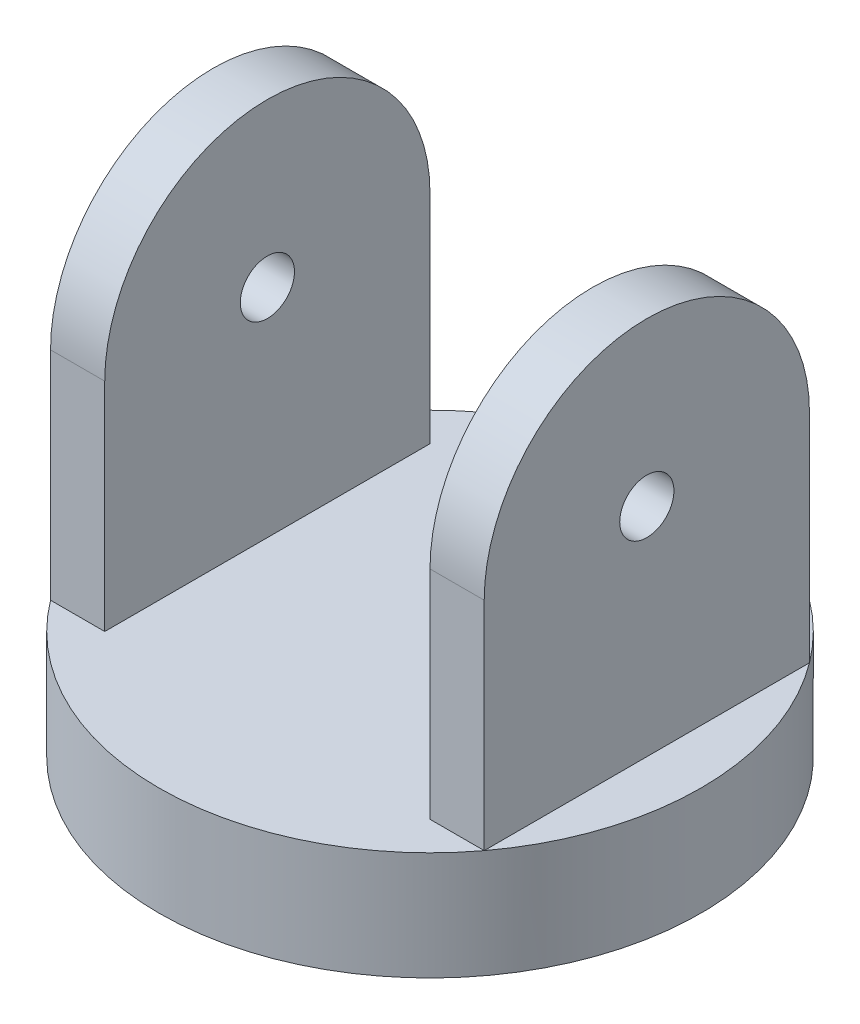
ISO-10303-21;
HEADER;
FILE_DESCRIPTION(('STEP AP214'),'2;1');
FILE_NAME('part.step','',(''),(''),'','','');
FILE_SCHEMA(('AUTOMOTIVE_DESIGN { 1 0 10303 214 1 1 1 1 }'));
ENDSEC;
DATA;
#1=APPLICATION_CONTEXT('core data for automotive mechanical design processes');
#2=APPLICATION_PROTOCOL_DEFINITION('international standard','automotive_design',2000,#1);
#3=PRODUCT_CONTEXT('',#1,'mechanical');
#4=PRODUCT('Part','Part','',(#3));
#5=PRODUCT_RELATED_PRODUCT_CATEGORY('part','',(#4));
#6=PRODUCT_DEFINITION_FORMATION('','',#4);
#7=PRODUCT_DEFINITION_CONTEXT('part definition',#1,'design');
#8=PRODUCT_DEFINITION('design','',#6,#7);
#9=PRODUCT_DEFINITION_SHAPE('','',#8);
#10=(LENGTH_UNIT() NAMED_UNIT(*) SI_UNIT(.MILLI.,.METRE.));
#11=(NAMED_UNIT(*) PLANE_ANGLE_UNIT() SI_UNIT($,.RADIAN.));
#12=(NAMED_UNIT(*) SI_UNIT($,.STERADIAN.) SOLID_ANGLE_UNIT());
#13=UNCERTAINTY_MEASURE_WITH_UNIT(LENGTH_MEASURE(1.E-05),#10,'distance_accuracy_value','');
#14=(GEOMETRIC_REPRESENTATION_CONTEXT(3) GLOBAL_UNCERTAINTY_ASSIGNED_CONTEXT((#13)) GLOBAL_UNIT_ASSIGNED_CONTEXT((#10,
#11,#12)) REPRESENTATION_CONTEXT('',''));
#15=CARTESIAN_POINT('',(0.,0.,0.));
#16=DIRECTION('',(0.,0.,1.));
#17=DIRECTION('',(1.,0.,0.));
#18=AXIS2_PLACEMENT_3D('',#15,#16,#17);
#19=CARTESIAN_POINT('',(20.,50.,15.));
#20=DIRECTION('',(-1.,0.,0.));
#21=DIRECTION('',(0.,0.,1.));
#22=AXIS2_PLACEMENT_3D('',#19,#20,#21);
#23=PLANE('',#22);
#24=CARTESIAN_POINT('',(20.,30.,0.));
#25=DIRECTION('',(-1.,0.,0.));
#26=DIRECTION('',(0.,0.,1.));
#27=AXIS2_PLACEMENT_3D('',#24,#25,#26);
#28=CIRCLE('',#27,2.5);
#29=CARTESIAN_POINT('',(20.,30.,2.50000000000001));
#30=VERTEX_POINT('',#29);
#31=EDGE_CURVE('E133',#30,#30,#28,.T.);
#32=ORIENTED_EDGE('',*,*,#31,.T.);
#33=EDGE_LOOP('',(#32));
#34=FACE_BOUND('',#33,.T.);
#35=CARTESIAN_POINT('',(20.,30.,0.));
#36=DIRECTION('',(-1.,0.,0.));
#37=DIRECTION('',(0.,0.,1.));
#38=AXIS2_PLACEMENT_3D('',#35,#36,#37);
#39=CIRCLE('',#38,15.);
#40=CARTESIAN_POINT('',(20.,30.,15.));
#41=VERTEX_POINT('',#40);
#42=CARTESIAN_POINT('',(20.,30.,-15.));
#43=VERTEX_POINT('',#42);
#44=EDGE_CURVE('E194',#41,#43,#39,.T.);
#45=ORIENTED_EDGE('',*,*,#44,.F.);
#46=DIRECTION('',(0.,-1.,0.));
#47=VECTOR('',#46,1.);
#48=CARTESIAN_POINT('',(20.,50.,15.));
#49=LINE('',#48,#47);
#50=CARTESIAN_POINT('',(20.,10.,15.));
#51=VERTEX_POINT('',#50);
#52=EDGE_CURVE('E158',#41,#51,#49,.T.);
#53=ORIENTED_EDGE('',*,*,#52,.T.);
#54=DIRECTION('',(0.,0.,-1.));
#55=VECTOR('',#54,1.);
#56=CARTESIAN_POINT('',(20.,10.,15.));
#57=LINE('',#56,#55);
#58=CARTESIAN_POINT('',(20.,10.,-15.));
#59=VERTEX_POINT('',#58);
#60=EDGE_CURVE('E141',#51,#59,#57,.T.);
#61=ORIENTED_EDGE('',*,*,#60,.T.);
#62=DIRECTION('',(0.,-1.,0.));
#63=VECTOR('',#62,1.);
#64=CARTESIAN_POINT('',(20.,50.,-15.));
#65=LINE('',#64,#63);
#66=EDGE_CURVE('E164',#43,#59,#65,.T.);
#67=ORIENTED_EDGE('',*,*,#66,.F.);
#68=EDGE_LOOP('',(#45,#53,#61,#67));
#69=FACE_BOUND('',#68,.T.);
#70=ADVANCED_FACE('F50',(#34,#69),#23,.F.);
#71=CARTESIAN_POINT('',(20.,50.,-15.));
#72=DIRECTION('',(0.,0.,1.));
#73=DIRECTION('',(1.,0.,0.));
#74=AXIS2_PLACEMENT_3D('',#71,#72,#73);
#75=PLANE('',#74);
#76=DIRECTION('',(-1.,0.,0.));
#77=VECTOR('',#76,1.);
#78=CARTESIAN_POINT('',(25.,30.,-15.));
#79=LINE('',#78,#77);
#80=CARTESIAN_POINT('',(15.,30.,-15.));
#81=VERTEX_POINT('',#80);
#82=EDGE_CURVE('E122',#43,#81,#79,.T.);
#83=ORIENTED_EDGE('',*,*,#82,.F.);
#84=ORIENTED_EDGE('',*,*,#66,.T.);
#85=DIRECTION('',(-1.,0.,0.));
#86=VECTOR('',#85,1.);
#87=CARTESIAN_POINT('',(20.,10.,-15.));
#88=LINE('',#87,#86);
#89=CARTESIAN_POINT('',(15.,10.,-15.));
#90=VERTEX_POINT('',#89);
#91=EDGE_CURVE('E149',#59,#90,#88,.T.);
#92=ORIENTED_EDGE('',*,*,#91,.T.);
#93=DIRECTION('',(0.,-1.,0.));
#94=VECTOR('',#93,1.);
#95=CARTESIAN_POINT('',(15.,50.,-15.));
#96=LINE('',#95,#94);
#97=EDGE_CURVE('E162',#81,#90,#96,.T.);
#98=ORIENTED_EDGE('',*,*,#97,.F.);
#99=EDGE_LOOP('',(#83,#84,#92,#98));
#100=FACE_BOUND('',#99,.T.);
#101=ADVANCED_FACE('F201',(#100),#75,.F.);
#102=CARTESIAN_POINT('',(15.,50.,15.));
#103=DIRECTION('',(1.,0.,0.));
#104=DIRECTION('',(0.,0.,-1.));
#105=AXIS2_PLACEMENT_3D('',#102,#103,#104);
#106=PLANE('',#105);
#107=CARTESIAN_POINT('',(15.,30.,0.));
#108=DIRECTION('',(1.,0.,0.));
#109=DIRECTION('',(0.,0.,-1.));
#110=AXIS2_PLACEMENT_3D('',#107,#108,#109);
#111=CIRCLE('',#110,2.5);
#112=CARTESIAN_POINT('',(15.,30.,-2.49999999999999));
#113=VERTEX_POINT('',#112);
#114=EDGE_CURVE('E267',#113,#113,#111,.T.);
#115=ORIENTED_EDGE('',*,*,#114,.T.);
#116=EDGE_LOOP('',(#115));
#117=FACE_BOUND('',#116,.T.);
#118=CARTESIAN_POINT('',(15.,30.,0.));
#119=DIRECTION('',(1.,0.,0.));
#120=DIRECTION('',(0.,0.,-1.));
#121=AXIS2_PLACEMENT_3D('',#118,#119,#120);
#122=CIRCLE('',#121,15.);
#123=CARTESIAN_POINT('',(15.,30.,15.));
#124=VERTEX_POINT('',#123);
#125=EDGE_CURVE('E67',#81,#124,#122,.T.);
#126=ORIENTED_EDGE('',*,*,#125,.F.);
#127=ORIENTED_EDGE('',*,*,#97,.T.);
#128=DIRECTION('',(0.,0.,1.));
#129=VECTOR('',#128,1.);
#130=CARTESIAN_POINT('',(15.,10.,15.));
#131=LINE('',#130,#129);
#132=CARTESIAN_POINT('',(15.,10.,15.));
#133=VERTEX_POINT('',#132);
#134=EDGE_CURVE('E152',#90,#133,#131,.T.);
#135=ORIENTED_EDGE('',*,*,#134,.T.);
#136=DIRECTION('',(0.,-1.,0.));
#137=VECTOR('',#136,1.);
#138=CARTESIAN_POINT('',(15.,50.,15.));
#139=LINE('',#138,#137);
#140=EDGE_CURVE('E160',#124,#133,#139,.T.);
#141=ORIENTED_EDGE('',*,*,#140,.F.);
#142=EDGE_LOOP('',(#126,#127,#135,#141));
#143=FACE_BOUND('',#142,.T.);
#144=ADVANCED_FACE('F199',(#117,#143),#106,.F.);
#145=CARTESIAN_POINT('',(-15.,50.,15.));
#146=DIRECTION('',(-1.,0.,0.));
#147=DIRECTION('',(0.,0.,1.));
#148=AXIS2_PLACEMENT_3D('',#145,#146,#147);
#149=PLANE('',#148);
#150=CARTESIAN_POINT('',(-15.,30.,0.));
#151=DIRECTION('',(-1.,0.,0.));
#152=DIRECTION('',(0.,0.,1.));
#153=AXIS2_PLACEMENT_3D('',#150,#151,#152);
#154=CIRCLE('',#153,2.5);
#155=CARTESIAN_POINT('',(-15.,30.,2.5));
#156=VERTEX_POINT('',#155);
#157=EDGE_CURVE('E269',#156,#156,#154,.T.);
#158=ORIENTED_EDGE('',*,*,#157,.T.);
#159=EDGE_LOOP('',(#158));
#160=FACE_BOUND('',#159,.T.);
#161=CARTESIAN_POINT('',(-15.,30.,0.));
#162=DIRECTION('',(-1.,0.,0.));
#163=DIRECTION('',(0.,0.,1.));
#164=AXIS2_PLACEMENT_3D('',#161,#162,#163);
#165=CIRCLE('',#164,15.);
#166=CARTESIAN_POINT('',(-15.,30.,15.));
#167=VERTEX_POINT('',#166);
#168=CARTESIAN_POINT('',(-15.,30.,-15.));
#169=VERTEX_POINT('',#168);
#170=EDGE_CURVE('E118',#167,#169,#165,.T.);
#171=ORIENTED_EDGE('',*,*,#170,.F.);
#172=DIRECTION('',(0.,-1.,0.));
#173=VECTOR('',#172,1.);
#174=CARTESIAN_POINT('',(-15.,50.,15.));
#175=LINE('',#174,#173);
#176=CARTESIAN_POINT('',(-15.,10.,15.));
#177=VERTEX_POINT('',#176);
#178=EDGE_CURVE('E143',#167,#177,#175,.T.);
#179=ORIENTED_EDGE('',*,*,#178,.T.);
#180=DIRECTION('',(0.,0.,-1.));
#181=VECTOR('',#180,1.);
#182=CARTESIAN_POINT('',(-15.,10.,15.));
#183=LINE('',#182,#181);
#184=CARTESIAN_POINT('',(-15.,10.,-15.));
#185=VERTEX_POINT('',#184);
#186=EDGE_CURVE('E208',#177,#185,#183,.T.);
#187=ORIENTED_EDGE('',*,*,#186,.T.);
#188=DIRECTION('',(0.,-1.,0.));
#189=VECTOR('',#188,1.);
#190=CARTESIAN_POINT('',(-15.,50.,-15.));
#191=LINE('',#190,#189);
#192=EDGE_CURVE('E139',#169,#185,#191,.T.);
#193=ORIENTED_EDGE('',*,*,#192,.F.);
#194=EDGE_LOOP('',(#171,#179,#187,#193));
#195=FACE_BOUND('',#194,.T.);
#196=ADVANCED_FACE('F218',(#160,#195),#149,.F.);
#197=CARTESIAN_POINT('',(-15.,50.,-15.));
#198=DIRECTION('',(0.,0.,1.));
#199=DIRECTION('',(1.,0.,0.));
#200=AXIS2_PLACEMENT_3D('',#197,#198,#199);
#201=PLANE('',#200);
#202=CARTESIAN_POINT('',(-20.,30.,-15.));
#203=VERTEX_POINT('',#202);
#204=EDGE_CURVE('E115',#169,#203,#79,.T.);
#205=ORIENTED_EDGE('',*,*,#204,.F.);
#206=ORIENTED_EDGE('',*,*,#192,.T.);
#207=DIRECTION('',(-1.,0.,0.));
#208=VECTOR('',#207,1.);
#209=CARTESIAN_POINT('',(-15.,10.,-15.));
#210=LINE('',#209,#208);
#211=CARTESIAN_POINT('',(-20.,10.,-15.));
#212=VERTEX_POINT('',#211);
#213=EDGE_CURVE('E137',#185,#212,#210,.T.);
#214=ORIENTED_EDGE('',*,*,#213,.T.);
#215=DIRECTION('',(0.,-1.,0.));
#216=VECTOR('',#215,1.);
#217=CARTESIAN_POINT('',(-20.,50.,-15.));
#218=LINE('',#217,#216);
#219=EDGE_CURVE('E129',#203,#212,#218,.T.);
#220=ORIENTED_EDGE('',*,*,#219,.F.);
#221=EDGE_LOOP('',(#205,#206,#214,#220));
#222=FACE_BOUND('',#221,.T.);
#223=ADVANCED_FACE('F135',(#222),#201,.F.);
#224=CARTESIAN_POINT('',(-20.,50.,15.));
#225=DIRECTION('',(1.,0.,0.));
#226=DIRECTION('',(0.,0.,-1.));
#227=AXIS2_PLACEMENT_3D('',#224,#225,#226);
#228=PLANE('',#227);
#229=CARTESIAN_POINT('',(-20.,30.,0.));
#230=DIRECTION('',(-1.,0.,0.));
#231=DIRECTION('',(0.,0.,1.));
#232=AXIS2_PLACEMENT_3D('',#229,#230,#231);
#233=CIRCLE('',#232,2.5);
#234=CARTESIAN_POINT('',(-20.,30.,2.5));
#235=VERTEX_POINT('',#234);
#236=EDGE_CURVE('E274',#235,#235,#233,.T.);
#237=ORIENTED_EDGE('',*,*,#236,.F.);
#238=EDGE_LOOP('',(#237));
#239=FACE_BOUND('',#238,.T.);
#240=CARTESIAN_POINT('',(-20.,30.,0.));
#241=DIRECTION('',(-1.,0.,0.));
#242=DIRECTION('',(0.,0.,1.));
#243=AXIS2_PLACEMENT_3D('',#240,#241,#242);
#244=CIRCLE('',#243,15.);
#245=CARTESIAN_POINT('',(-20.,30.,15.));
#246=VERTEX_POINT('',#245);
#247=EDGE_CURVE('E75',#246,#203,#244,.T.);
#248=ORIENTED_EDGE('',*,*,#247,.T.);
#249=ORIENTED_EDGE('',*,*,#219,.T.);
#250=DIRECTION('',(0.,0.,1.));
#251=VECTOR('',#250,1.);
#252=CARTESIAN_POINT('',(-20.,10.,15.));
#253=LINE('',#252,#251);
#254=CARTESIAN_POINT('',(-20.,10.,15.));
#255=VERTEX_POINT('',#254);
#256=EDGE_CURVE('E212',#212,#255,#253,.T.);
#257=ORIENTED_EDGE('',*,*,#256,.T.);
#258=DIRECTION('',(0.,-1.,0.));
#259=VECTOR('',#258,1.);
#260=CARTESIAN_POINT('',(-20.,50.,15.));
#261=LINE('',#260,#259);
#262=EDGE_CURVE('E131',#246,#255,#261,.T.);
#263=ORIENTED_EDGE('',*,*,#262,.F.);
#264=EDGE_LOOP('',(#248,#249,#257,#263));
#265=FACE_BOUND('',#264,.T.);
#266=ADVANCED_FACE('F127',(#239,#265),#228,.F.);
#267=CARTESIAN_POINT('',(0.,10.,0.));
#268=DIRECTION('',(0.,1.,0.));
#269=DIRECTION('',(0.,0.,1.));
#270=AXIS2_PLACEMENT_3D('',#267,#268,#269);
#271=PLANE('',#270);
#272=ORIENTED_EDGE('',*,*,#213,.F.);
#273=ORIENTED_EDGE('',*,*,#186,.F.);
#274=DIRECTION('',(1.,0.,0.));
#275=VECTOR('',#274,1.);
#276=CARTESIAN_POINT('',(-15.,10.,15.));
#277=LINE('',#276,#275);
#278=EDGE_CURVE('E214',#255,#177,#277,.T.);
#279=ORIENTED_EDGE('',*,*,#278,.F.);
#280=CARTESIAN_POINT('',(0.,10.,0.));
#281=DIRECTION('',(0.,1.,0.));
#282=DIRECTION('',(0.,0.,1.));
#283=AXIS2_PLACEMENT_3D('',#280,#281,#282);
#284=CIRCLE('',#283,25.);
#285=EDGE_CURVE('E60',#255,#51,#284,.T.);
#286=ORIENTED_EDGE('',*,*,#285,.T.);
#287=DIRECTION('',(1.,0.,0.));
#288=VECTOR('',#287,1.);
#289=CARTESIAN_POINT('',(20.,10.,15.));
#290=LINE('',#289,#288);
#291=EDGE_CURVE('E155',#133,#51,#290,.T.);
#292=ORIENTED_EDGE('',*,*,#291,.F.);
#293=ORIENTED_EDGE('',*,*,#134,.F.);
#294=ORIENTED_EDGE('',*,*,#91,.F.);
#295=EDGE_CURVE('E59',#59,#212,#284,.T.);
#296=ORIENTED_EDGE('',*,*,#295,.T.);
#297=EDGE_LOOP('',(#272,#273,#279,#286,#292,#293,#294,#296));
#298=FACE_BOUND('',#297,.T.);
#299=ADVANCED_FACE('F184',(#298),#271,.T.);
#300=EDGE_CURVE('E173',#212,#255,#284,.T.);
#301=ORIENTED_EDGE('',*,*,#300,.T.);
#302=ORIENTED_EDGE('',*,*,#256,.F.);
#303=EDGE_LOOP('',(#301,#302));
#304=FACE_BOUND('',#303,.T.);
#305=ADVANCED_FACE('F221',(#304),#271,.T.);
#306=ORIENTED_EDGE('',*,*,#60,.F.);
#307=EDGE_CURVE('E12',#51,#59,#284,.T.);
#308=ORIENTED_EDGE('',*,*,#307,.T.);
#309=EDGE_LOOP('',(#306,#308));
#310=FACE_BOUND('',#309,.T.);
#311=ADVANCED_FACE('F190',(#310),#271,.T.);
#312=CARTESIAN_POINT('',(0.,10.,0.));
#313=DIRECTION('',(0.,-1.,0.));
#314=DIRECTION('',(0.,0.,-1.));
#315=AXIS2_PLACEMENT_3D('',#312,#313,#314);
#316=CYLINDRICAL_SURFACE('',#315,25.);
#317=ORIENTED_EDGE('',*,*,#307,.F.);
#318=ORIENTED_EDGE('',*,*,#285,.F.);
#319=ORIENTED_EDGE('',*,*,#300,.F.);
#320=ORIENTED_EDGE('',*,*,#295,.F.);
#321=EDGE_LOOP('',(#317,#318,#319,#320));
#322=FACE_BOUND('',#321,.T.);
#323=CARTESIAN_POINT('',(0.,0.,0.));
#324=DIRECTION('',(0.,1.,0.));
#325=DIRECTION('',(0.,0.,1.));
#326=AXIS2_PLACEMENT_3D('',#323,#324,#325);
#327=CIRCLE('',#326,25.);
#328=CARTESIAN_POINT('',(0.,0.,25.));
#329=VERTEX_POINT('',#328);
#330=EDGE_CURVE('E54',#329,#329,#327,.T.);
#331=ORIENTED_EDGE('',*,*,#330,.T.);
#332=EDGE_LOOP('',(#331));
#333=FACE_BOUND('',#332,.T.);
#334=ADVANCED_FACE('F52',(#322,#333),#316,.T.);
#335=CARTESIAN_POINT('',(0.,0.,0.));
#336=DIRECTION('',(0.,1.,0.));
#337=DIRECTION('',(0.,0.,1.));
#338=AXIS2_PLACEMENT_3D('',#335,#336,#337);
#339=PLANE('',#338);
#340=ORIENTED_EDGE('',*,*,#330,.F.);
#341=EDGE_LOOP('',(#340));
#342=FACE_BOUND('',#341,.T.);
#343=ADVANCED_FACE('F242',(#342),#339,.F.);
#344=CARTESIAN_POINT('',(20.,50.,15.));
#345=DIRECTION('',(0.,0.,-1.));
#346=DIRECTION('',(-1.,0.,0.));
#347=AXIS2_PLACEMENT_3D('',#344,#345,#346);
#348=PLANE('',#347);
#349=ORIENTED_EDGE('',*,*,#52,.F.);
#350=DIRECTION('',(-1.,0.,0.));
#351=VECTOR('',#350,1.);
#352=CARTESIAN_POINT('',(25.,30.,15.));
#353=LINE('',#352,#351);
#354=EDGE_CURVE('E123',#41,#124,#353,.T.);
#355=ORIENTED_EDGE('',*,*,#354,.T.);
#356=ORIENTED_EDGE('',*,*,#140,.T.);
#357=ORIENTED_EDGE('',*,*,#291,.T.);
#358=EDGE_LOOP('',(#349,#355,#356,#357));
#359=FACE_BOUND('',#358,.T.);
#360=ADVANCED_FACE('F196',(#359),#348,.F.);
#361=CARTESIAN_POINT('',(-15.,50.,15.));
#362=DIRECTION('',(0.,0.,-1.));
#363=DIRECTION('',(-1.,0.,0.));
#364=AXIS2_PLACEMENT_3D('',#361,#362,#363);
#365=PLANE('',#364);
#366=ORIENTED_EDGE('',*,*,#178,.F.);
#367=EDGE_CURVE('E132',#167,#246,#353,.T.);
#368=ORIENTED_EDGE('',*,*,#367,.T.);
#369=ORIENTED_EDGE('',*,*,#262,.T.);
#370=ORIENTED_EDGE('',*,*,#278,.T.);
#371=EDGE_LOOP('',(#366,#368,#369,#370));
#372=FACE_BOUND('',#371,.T.);
#373=ADVANCED_FACE('F220',(#372),#365,.F.);
#374=CARTESIAN_POINT('',(25.,30.,0.));
#375=DIRECTION('',(-1.,0.,0.));
#376=DIRECTION('',(0.,0.,1.));
#377=AXIS2_PLACEMENT_3D('',#374,#375,#376);
#378=CYLINDRICAL_SURFACE('',#377,15.);
#379=ORIENTED_EDGE('',*,*,#170,.T.);
#380=ORIENTED_EDGE('',*,*,#204,.T.);
#381=ORIENTED_EDGE('',*,*,#247,.F.);
#382=ORIENTED_EDGE('',*,*,#367,.F.);
#383=EDGE_LOOP('',(#379,#380,#381,#382));
#384=FACE_BOUND('',#383,.T.);
#385=ADVANCED_FACE('F116',(#384),#378,.T.);
#386=ORIENTED_EDGE('',*,*,#44,.T.);
#387=ORIENTED_EDGE('',*,*,#82,.T.);
#388=ORIENTED_EDGE('',*,*,#125,.T.);
#389=ORIENTED_EDGE('',*,*,#354,.F.);
#390=EDGE_LOOP('',(#386,#387,#388,#389));
#391=FACE_BOUND('',#390,.T.);
#392=ADVANCED_FACE('F253',(#391),#378,.T.);
#393=CARTESIAN_POINT('',(25.,30.,0.));
#394=DIRECTION('',(-1.,0.,0.));
#395=DIRECTION('',(0.,0.,1.));
#396=AXIS2_PLACEMENT_3D('',#393,#394,#395);
#397=CYLINDRICAL_SURFACE('',#396,2.5);
#398=ORIENTED_EDGE('',*,*,#236,.T.);
#399=EDGE_LOOP('',(#398));
#400=FACE_BOUND('',#399,.T.);
#401=ORIENTED_EDGE('',*,*,#157,.F.);
#402=EDGE_LOOP('',(#401));
#403=FACE_BOUND('',#402,.T.);
#404=ADVANCED_FACE('F256',(#400,#403),#397,.F.);
#405=ORIENTED_EDGE('',*,*,#114,.F.);
#406=EDGE_LOOP('',(#405));
#407=FACE_BOUND('',#406,.T.);
#408=ORIENTED_EDGE('',*,*,#31,.F.);
#409=EDGE_LOOP('',(#408));
#410=FACE_BOUND('',#409,.T.);
#411=ADVANCED_FACE('F257',(#407,#410),#397,.F.);
#412=CLOSED_SHELL('',(#70,#101,#144,#196,#223,#266,#299,#305,#311,#334,#343,#360,#373,#385,#392,
#404,#411));
#413=MANIFOLD_SOLID_BREP('B2',#412);
#414=ADVANCED_BREP_SHAPE_REPRESENTATION('',(#18,#413),#14);
#415=SHAPE_DEFINITION_REPRESENTATION(#9,#414);
ENDSEC;
END-ISO-10303-21;
